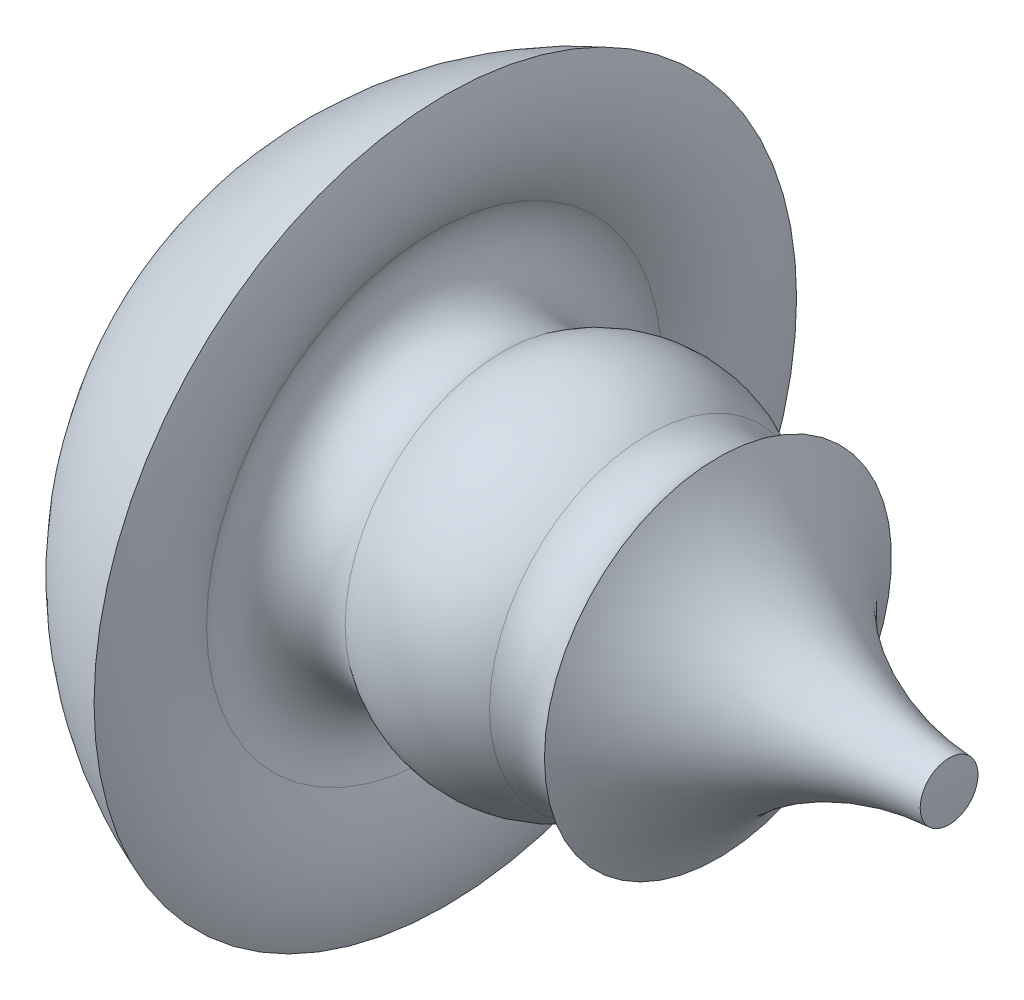
ISO-10303-21;
HEADER;
FILE_DESCRIPTION(('STEP AP214'),'2;1');
FILE_NAME('part.step','',(''),(''),'','','');
FILE_SCHEMA(('AUTOMOTIVE_DESIGN { 1 0 10303 214 1 1 1 1 }'));
ENDSEC;
DATA;
#1=APPLICATION_CONTEXT('core data for automotive mechanical design processes');
#2=APPLICATION_PROTOCOL_DEFINITION('international standard','automotive_design',2000,#1);
#3=PRODUCT_CONTEXT('',#1,'mechanical');
#4=PRODUCT('Part','Part','',(#3));
#5=PRODUCT_RELATED_PRODUCT_CATEGORY('part','',(#4));
#6=PRODUCT_DEFINITION_FORMATION('','',#4);
#7=PRODUCT_DEFINITION_CONTEXT('part definition',#1,'design');
#8=PRODUCT_DEFINITION('design','',#6,#7);
#9=PRODUCT_DEFINITION_SHAPE('','',#8);
#10=(LENGTH_UNIT() NAMED_UNIT(*) SI_UNIT(.MILLI.,.METRE.));
#11=(NAMED_UNIT(*) PLANE_ANGLE_UNIT() SI_UNIT($,.RADIAN.));
#12=(NAMED_UNIT(*) SI_UNIT($,.STERADIAN.) SOLID_ANGLE_UNIT());
#13=UNCERTAINTY_MEASURE_WITH_UNIT(LENGTH_MEASURE(1.E-05),#10,'distance_accuracy_value','');
#14=(GEOMETRIC_REPRESENTATION_CONTEXT(3) GLOBAL_UNCERTAINTY_ASSIGNED_CONTEXT((#13)) GLOBAL_UNIT_ASSIGNED_CONTEXT((#10,
#11,#12)) REPRESENTATION_CONTEXT('',''));
#15=CARTESIAN_POINT('',(0.,0.,0.));
#16=DIRECTION('',(0.,0.,1.));
#17=DIRECTION('',(1.,0.,0.));
#18=AXIS2_PLACEMENT_3D('',#15,#16,#17);
#19=CARTESIAN_POINT('',(40.,0.,0.));
#20=DIRECTION('',(-1.,0.,0.));
#21=DIRECTION('',(0.,0.,1.));
#22=AXIS2_PLACEMENT_3D('',#19,#20,#21);
#23=TOROIDAL_SURFACE('',#22,80.,20.);
#24=CARTESIAN_POINT('',(28.9059960754954,0.,0.));
#25=DIRECTION('',(-1.,0.,0.));
#26=DIRECTION('',(0.,0.,1.));
#27=AXIS2_PLACEMENT_3D('',#24,#25,#26);
#28=CIRCLE('',#27,63.3589941132431);
#29=CARTESIAN_POINT('',(28.9059960754954,0.,63.3589941132431));
#30=VERTEX_POINT('',#29);
#31=EDGE_CURVE('E36',#30,#30,#28,.T.);
#32=ORIENTED_EDGE('',*,*,#31,.F.);
#33=EDGE_LOOP('',(#32));
#34=FACE_BOUND('',#33,.T.);
#35=CARTESIAN_POINT('',(57.017133084223,0.,0.));
#36=DIRECTION('',(-1.,0.,0.));
#37=DIRECTION('',(0.,0.,1.));
#38=AXIS2_PLACEMENT_3D('',#35,#36,#37);
#39=CIRCLE('',#38,69.4920419874344);
#40=CARTESIAN_POINT('',(57.017133084223,0.,69.4920419874344));
#41=VERTEX_POINT('',#40);
#42=EDGE_CURVE('E32',#41,#41,#39,.T.);
#43=ORIENTED_EDGE('',*,*,#42,.T.);
#44=EDGE_LOOP('',(#43));
#45=FACE_BOUND('',#44,.T.);
#46=ADVANCED_FACE('F28',(#34,#45),#23,.F.);
#47=CARTESIAN_POINT('',(-100.,0.,0.));
#48=DIRECTION('',(-1.,0.,0.));
#49=DIRECTION('',(0.,0.,1.));
#50=AXIS2_PLACEMENT_3D('',#47,#48,#49);
#51=TOROIDAL_SURFACE('',#50,120.,52.1110255092798);
#52=CARTESIAN_POINT('',(-56.6410058867568,0.,0.));
#53=DIRECTION('',(-1.,0.,0.));
#54=DIRECTION('',(0.,0.,1.));
#55=AXIS2_PLACEMENT_3D('',#52,#53,#54);
#56=CIRCLE('',#55,91.0940039245046);
#57=CARTESIAN_POINT('',(-56.6410058867568,0.,91.0940039245046));
#58=VERTEX_POINT('',#57);
#59=EDGE_CURVE('E45',#58,#58,#56,.T.);
#60=ORIENTED_EDGE('',*,*,#59,.T.);
#61=EDGE_LOOP('',(#60));
#62=FACE_BOUND('',#61,.T.);
#63=CARTESIAN_POINT('',(-52.1516739671503,0.,0.));
#64=DIRECTION('',(1.,0.,0.));
#65=DIRECTION('',(0.,0.,-1.));
#66=AXIS2_PLACEMENT_3D('',#63,#64,#65);
#67=CIRCLE('',#66,140.642109278921);
#68=CARTESIAN_POINT('',(-52.1516739671503,0.,-140.642109278921));
#69=VERTEX_POINT('',#68);
#70=EDGE_CURVE('E10',#69,#69,#67,.T.);
#71=ORIENTED_EDGE('',*,*,#70,.T.);
#72=EDGE_LOOP('',(#71));
#73=FACE_BOUND('',#72,.T.);
#74=ADVANCED_FACE('F69',(#62,#73),#51,.T.);
#75=CARTESIAN_POINT('',(0.,0.,0.));
#76=DIRECTION('',(-1.,0.,0.));
#77=DIRECTION('',(0.,0.,1.));
#78=AXIS2_PLACEMENT_3D('',#75,#76,#77);
#79=DEGENERATE_TOROIDAL_SURFACE('',#78,20.,52.1110255092798,.T.);
#80=ORIENTED_EDGE('',*,*,#31,.T.);
#81=EDGE_LOOP('',(#80));
#82=FACE_BOUND('',#81,.T.);
#83=CARTESIAN_POINT('',(-28.9059960754954,0.,0.));
#84=DIRECTION('',(-1.,0.,0.));
#85=DIRECTION('',(0.,0.,1.));
#86=AXIS2_PLACEMENT_3D('',#83,#84,#85);
#87=CIRCLE('',#86,63.3589941132431);
#88=CARTESIAN_POINT('',(-28.9059960754954,0.,63.3589941132431));
#89=VERTEX_POINT('',#88);
#90=EDGE_CURVE('E40',#89,#89,#87,.T.);
#91=ORIENTED_EDGE('',*,*,#90,.F.);
#92=EDGE_LOOP('',(#91));
#93=FACE_BOUND('',#92,.T.);
#94=ADVANCED_FACE('F74',(#82,#93),#79,.T.);
#95=CARTESIAN_POINT('',(-40.,0.,0.));
#96=DIRECTION('',(-1.,0.,0.));
#97=DIRECTION('',(0.,0.,1.));
#98=AXIS2_PLACEMENT_3D('',#95,#96,#97);
#99=TOROIDAL_SURFACE('',#98,80.,20.);
#100=ORIENTED_EDGE('',*,*,#90,.T.);
#101=EDGE_LOOP('',(#100));
#102=FACE_BOUND('',#101,.T.);
#103=ORIENTED_EDGE('',*,*,#59,.F.);
#104=EDGE_LOOP('',(#103));
#105=FACE_BOUND('',#104,.T.);
#106=ADVANCED_FACE('F65',(#102,#105),#99,.F.);
#107=CARTESIAN_POINT('',(0.,0.,0.));
#108=DIRECTION('',(0.,1.,0.));
#109=DIRECTION('',(1.,0.,0.));
#110=AXIS2_PLACEMENT_3D('',#107,#108,#109);
#111=SPHERICAL_SURFACE('',#110,150.);
#112=CARTESIAN_POINT('',(0.,0.,0.));
#113=DIRECTION('',(1.,0.,0.));
#114=DIRECTION('',(0.,0.,-1.));
#115=AXIS2_PLACEMENT_3D('',#112,#113,#114);
#116=SPHERICAL_SURFACE('',#115,150.);
#117=ORIENTED_EDGE('',*,*,#70,.F.);
#118=EDGE_LOOP('',(#117));
#119=FACE_BOUND('',#118,.T.);
#120=ADVANCED_FACE('F58',(#119),#116,.T.);
#121=CARTESIAN_POINT('',(154.971164559734,0.,0.));
#122=DIRECTION('',(-1.,0.,0.));
#123=DIRECTION('',(0.,0.,1.));
#124=AXIS2_PLACEMENT_3D('',#121,#122,#123);
#125=TOROIDAL_SURFACE('',#124,123.105389070299,111.666392740758);
#126=ORIENTED_EDGE('',*,*,#42,.F.);
#127=EDGE_LOOP('',(#126));
#128=FACE_BOUND('',#127,.T.);
#129=CARTESIAN_POINT('',(149.553077961658,0.,0.));
#130=DIRECTION('',(1.,0.,0.));
#131=DIRECTION('',(0.,0.,-1.));
#132=AXIS2_PLACEMENT_3D('',#129,#130,#131);
#133=CIRCLE('',#132,11.5705173693419);
#134=CARTESIAN_POINT('',(149.553077961658,0.,-11.5705173693419));
#135=VERTEX_POINT('',#134);
#136=EDGE_CURVE('E48',#135,#135,#133,.F.);
#137=ORIENTED_EDGE('',*,*,#136,.T.);
#138=EDGE_LOOP('',(#137));
#139=FACE_BOUND('',#138,.T.);
#140=ADVANCED_FACE('F56',(#128,#139),#125,.F.);
#141=CARTESIAN_POINT('',(0.,0.,0.));
#142=DIRECTION('',(1.,0.,0.));
#143=DIRECTION('',(0.,0.,-1.));
#144=AXIS2_PLACEMENT_3D('',#141,#142,#143);
#145=SPHERICAL_SURFACE('',#144,150.);
#146=ORIENTED_EDGE('',*,*,#136,.F.);
#147=EDGE_LOOP('',(#146));
#148=FACE_BOUND('',#147,.T.);
#149=ADVANCED_FACE('F30',(#148),#145,.T.);
#150=CLOSED_SHELL('',(#46,#74,#94,#106,#120,#140,#149));
#151=MANIFOLD_SOLID_BREP('B2',#150);
#152=ADVANCED_BREP_SHAPE_REPRESENTATION('',(#18,#151),#14);
#153=SHAPE_DEFINITION_REPRESENTATION(#9,#152);
ENDSEC;
END-ISO-10303-21;
